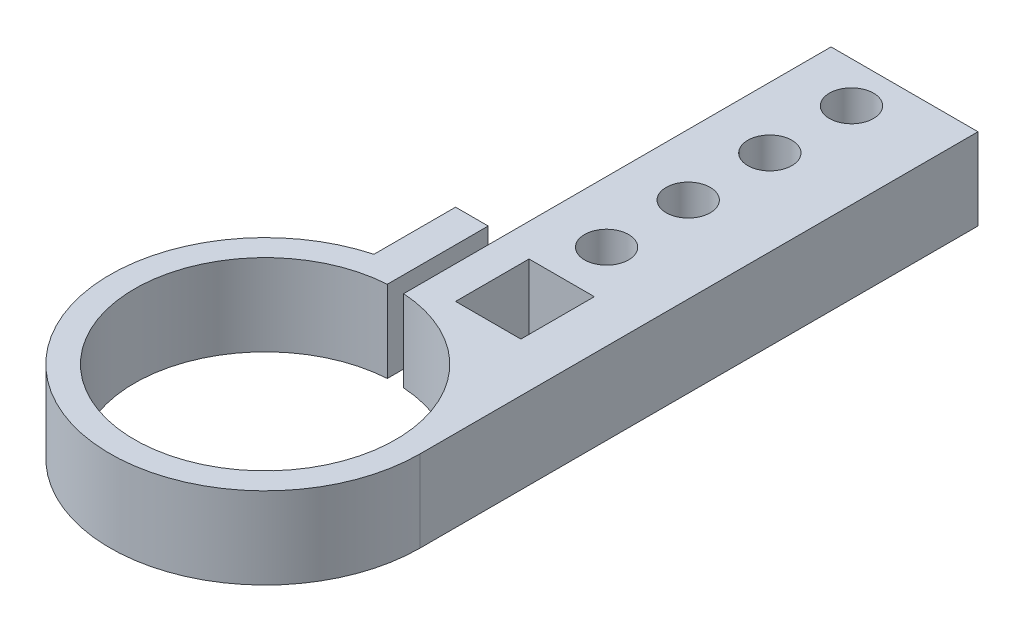
ISO-10303-21;
HEADER;
FILE_DESCRIPTION(('STEP AP214'),'2;1');
FILE_NAME('part.step','',(''),(''),'','','');
FILE_SCHEMA(('AUTOMOTIVE_DESIGN { 1 0 10303 214 1 1 1 1 }'));
ENDSEC;
DATA;
#1=APPLICATION_CONTEXT('core data for automotive mechanical design processes');
#2=APPLICATION_PROTOCOL_DEFINITION('international standard','automotive_design',2000,#1);
#3=PRODUCT_CONTEXT('',#1,'mechanical');
#4=PRODUCT('Part','Part','',(#3));
#5=PRODUCT_RELATED_PRODUCT_CATEGORY('part','',(#4));
#6=PRODUCT_DEFINITION_FORMATION('','',#4);
#7=PRODUCT_DEFINITION_CONTEXT('part definition',#1,'design');
#8=PRODUCT_DEFINITION('design','',#6,#7);
#9=PRODUCT_DEFINITION_SHAPE('','',#8);
#10=(LENGTH_UNIT() NAMED_UNIT(*) SI_UNIT(.MILLI.,.METRE.));
#11=(NAMED_UNIT(*) PLANE_ANGLE_UNIT() SI_UNIT($,.RADIAN.));
#12=(NAMED_UNIT(*) SI_UNIT($,.STERADIAN.) SOLID_ANGLE_UNIT());
#13=UNCERTAINTY_MEASURE_WITH_UNIT(LENGTH_MEASURE(1.E-05),#10,'distance_accuracy_value','');
#14=(GEOMETRIC_REPRESENTATION_CONTEXT(3) GLOBAL_UNCERTAINTY_ASSIGNED_CONTEXT((#13)) GLOBAL_UNIT_ASSIGNED_CONTEXT((#10,
#11,#12)) REPRESENTATION_CONTEXT('',''));
#15=CARTESIAN_POINT('',(0.,0.,0.));
#16=DIRECTION('',(0.,0.,1.));
#17=DIRECTION('',(1.,0.,0.));
#18=AXIS2_PLACEMENT_3D('',#15,#16,#17);
#19=CARTESIAN_POINT('',(0.,12.7,0.));
#20=DIRECTION('',(0.,-1.,0.));
#21=DIRECTION('',(0.,0.,-1.));
#22=AXIS2_PLACEMENT_3D('',#19,#20,#21);
#23=CYLINDRICAL_SURFACE('',#22,24.13);
#24=DIRECTION('',(0.,-1.,0.));
#25=VECTOR('',#24,1.);
#26=CARTESIAN_POINT('',(24.13,12.7,0.));
#27=LINE('',#26,#25);
#28=CARTESIAN_POINT('',(24.13,12.7,0.));
#29=VERTEX_POINT('',#28);
#30=CARTESIAN_POINT('',(24.13,0.,0.));
#31=VERTEX_POINT('',#30);
#32=EDGE_CURVE('E272',#29,#31,#27,.T.);
#33=ORIENTED_EDGE('',*,*,#32,.F.);
#34=CARTESIAN_POINT('',(0.,12.7,0.));
#35=DIRECTION('',(0.,1.,0.));
#36=DIRECTION('',(0.,0.,1.));
#37=AXIS2_PLACEMENT_3D('',#34,#35,#36);
#38=CIRCLE('',#37,24.13);
#39=CARTESIAN_POINT('',(-6.34999999999999,12.7,-23.2794845303757));
#40=VERTEX_POINT('',#39);
#41=EDGE_CURVE('E45',#40,#29,#38,.T.);
#42=ORIENTED_EDGE('',*,*,#41,.F.);
#43=DIRECTION('',(0.,-1.,0.));
#44=VECTOR('',#43,1.);
#45=CARTESIAN_POINT('',(-6.35,12.7,-23.2794845303757));
#46=LINE('',#45,#44);
#47=CARTESIAN_POINT('',(-6.35,0.,-23.2794845303757));
#48=VERTEX_POINT('',#47);
#49=EDGE_CURVE('E217',#40,#48,#46,.T.);
#50=ORIENTED_EDGE('',*,*,#49,.T.);
#51=CARTESIAN_POINT('',(0.,0.,0.));
#52=DIRECTION('',(0.,1.,0.));
#53=DIRECTION('',(0.,0.,1.));
#54=AXIS2_PLACEMENT_3D('',#51,#52,#53);
#55=CIRCLE('',#54,24.13);
#56=EDGE_CURVE('E200',#48,#31,#55,.T.);
#57=ORIENTED_EDGE('',*,*,#56,.T.);
#58=EDGE_LOOP('',(#33,#42,#50,#57));
#59=FACE_BOUND('',#58,.T.);
#60=ADVANCED_FACE('F38',(#59),#23,.T.);
#61=CARTESIAN_POINT('',(0.,12.7,0.));
#62=DIRECTION('',(0.,1.,0.));
#63=DIRECTION('',(0.,0.,1.));
#64=AXIS2_PLACEMENT_3D('',#61,#62,#63);
#65=PLANE('',#64);
#66=CARTESIAN_POINT('',(10.7950000000001,12.7,-67.7294845303757));
#67=DIRECTION('',(0.,1.,0.));
#68=DIRECTION('',(0.,0.,1.));
#69=AXIS2_PLACEMENT_3D('',#66,#67,#68);
#70=CIRCLE('',#69,3.42900000000001);
#71=CARTESIAN_POINT('',(10.7950000000001,12.7,-64.3004845303757));
#72=VERTEX_POINT('',#71);
#73=EDGE_CURVE('E171',#72,#72,#70,.T.);
#74=ORIENTED_EDGE('',*,*,#73,.F.);
#75=EDGE_LOOP('',(#74));
#76=FACE_BOUND('',#75,.T.);
#77=DIRECTION('',(1.,0.,0.));
#78=VECTOR('',#77,1.);
#79=CARTESIAN_POINT('',(6.35,12.7,-23.2794845303757));
#80=LINE('',#79,#78);
#81=CARTESIAN_POINT('',(6.35,12.7,-23.2794845303757));
#82=VERTEX_POINT('',#81);
#83=CARTESIAN_POINT('',(16.51,12.7,-23.2794845303757));
#84=VERTEX_POINT('',#83);
#85=EDGE_CURVE('E134',#82,#84,#80,.T.);
#86=ORIENTED_EDGE('',*,*,#85,.F.);
#87=DIRECTION('',(0.,0.,1.));
#88=VECTOR('',#87,1.);
#89=CARTESIAN_POINT('',(6.35,12.7,-34.7094845303757));
#90=LINE('',#89,#88);
#91=CARTESIAN_POINT('',(6.35,12.7,-34.7094845303757));
#92=VERTEX_POINT('',#91);
#93=EDGE_CURVE('E125',#92,#82,#90,.T.);
#94=ORIENTED_EDGE('',*,*,#93,.F.);
#95=DIRECTION('',(-1.,0.,0.));
#96=VECTOR('',#95,1.);
#97=CARTESIAN_POINT('',(6.35,12.7,-34.7094845303757));
#98=LINE('',#97,#96);
#99=CARTESIAN_POINT('',(16.51,12.7,-34.7094845303757));
#100=VERTEX_POINT('',#99);
#101=EDGE_CURVE('E153',#100,#92,#98,.T.);
#102=ORIENTED_EDGE('',*,*,#101,.F.);
#103=DIRECTION('',(0.,0.,-1.));
#104=VECTOR('',#103,1.);
#105=CARTESIAN_POINT('',(16.51,12.7,-34.7094845303757));
#106=LINE('',#105,#104);
#107=EDGE_CURVE('E148',#84,#100,#106,.T.);
#108=ORIENTED_EDGE('',*,*,#107,.F.);
#109=EDGE_LOOP('',(#86,#94,#102,#108));
#110=FACE_BOUND('',#109,.T.);
#111=CARTESIAN_POINT('',(10.7950000000003,12.7,-55.0294845303757));
#112=DIRECTION('',(0.,1.,0.));
#113=DIRECTION('',(0.,0.,1.));
#114=AXIS2_PLACEMENT_3D('',#111,#112,#113);
#115=CIRCLE('',#114,3.42900000000001);
#116=CARTESIAN_POINT('',(10.7950000000003,12.7,-51.6004845303757));
#117=VERTEX_POINT('',#116);
#118=EDGE_CURVE('E450',#117,#117,#115,.T.);
#119=ORIENTED_EDGE('',*,*,#118,.F.);
#120=EDGE_LOOP('',(#119));
#121=FACE_BOUND('',#120,.T.);
#122=CARTESIAN_POINT('',(10.7950000000004,12.7,-42.3294845303757));
#123=DIRECTION('',(0.,1.,0.));
#124=DIRECTION('',(0.,0.,1.));
#125=AXIS2_PLACEMENT_3D('',#122,#123,#124);
#126=CIRCLE('',#125,3.42900000000001);
#127=CARTESIAN_POINT('',(10.7950000000004,12.7,-38.9004845303757));
#128=VERTEX_POINT('',#127);
#129=EDGE_CURVE('E459',#128,#128,#126,.T.);
#130=ORIENTED_EDGE('',*,*,#129,.F.);
#131=EDGE_LOOP('',(#130));
#132=FACE_BOUND('',#131,.T.);
#133=CARTESIAN_POINT('',(10.795,12.7,-80.4294845303757));
#134=DIRECTION('',(0.,1.,0.));
#135=DIRECTION('',(0.,0.,1.));
#136=AXIS2_PLACEMENT_3D('',#133,#134,#135);
#137=CIRCLE('',#136,3.42900000000001);
#138=CARTESIAN_POINT('',(10.795,12.7,-77.0004845303757));
#139=VERTEX_POINT('',#138);
#140=EDGE_CURVE('E181',#139,#139,#137,.T.);
#141=ORIENTED_EDGE('',*,*,#140,.F.);
#142=EDGE_LOOP('',(#141));
#143=FACE_BOUND('',#142,.T.);
#144=ORIENTED_EDGE('',*,*,#41,.T.);
#145=DIRECTION('',(0.,0.,1.));
#146=VECTOR('',#145,1.);
#147=CARTESIAN_POINT('',(24.13,12.7,-35.9794845303757));
#148=LINE('',#147,#146);
#149=CARTESIAN_POINT('',(24.13,12.7,-86.7794845303757));
#150=VERTEX_POINT('',#149);
#151=EDGE_CURVE('E274',#150,#29,#148,.T.);
#152=ORIENTED_EDGE('',*,*,#151,.F.);
#153=DIRECTION('',(-1.,0.,0.));
#154=VECTOR('',#153,1.);
#155=CARTESIAN_POINT('',(24.13,12.7,-86.7794845303757));
#156=LINE('',#155,#154);
#157=CARTESIAN_POINT('',(1.27,12.7,-86.7794845303757));
#158=VERTEX_POINT('',#157);
#159=EDGE_CURVE('E186',#150,#158,#156,.T.);
#160=ORIENTED_EDGE('',*,*,#159,.T.);
#161=DIRECTION('',(0.,0.,-1.));
#162=VECTOR('',#161,1.);
#163=CARTESIAN_POINT('',(1.27,12.7,-1.43164468337886));
#164=LINE('',#163,#162);
#165=CARTESIAN_POINT('',(1.27,12.7,-20.2802736667926));
#166=VERTEX_POINT('',#165);
#167=EDGE_CURVE('E231',#166,#158,#164,.T.);
#168=ORIENTED_EDGE('',*,*,#167,.F.);
#169=CARTESIAN_POINT('',(0.,12.7,0.));
#170=DIRECTION('',(0.,1.,0.));
#171=DIRECTION('',(0.,0.,1.));
#172=AXIS2_PLACEMENT_3D('',#169,#170,#171);
#173=CIRCLE('',#172,20.32);
#174=CARTESIAN_POINT('',(-1.27,12.7,-20.2802736667926));
#175=VERTEX_POINT('',#174);
#176=EDGE_CURVE('E204',#175,#166,#173,.T.);
#177=ORIENTED_EDGE('',*,*,#176,.F.);
#178=DIRECTION('',(0.,0.,1.));
#179=VECTOR('',#178,1.);
#180=CARTESIAN_POINT('',(-1.27,12.7,-1.43164468337886));
#181=LINE('',#180,#179);
#182=CARTESIAN_POINT('',(-1.27,12.7,-35.9794845303757));
#183=VERTEX_POINT('',#182);
#184=EDGE_CURVE('E227',#183,#175,#181,.T.);
#185=ORIENTED_EDGE('',*,*,#184,.F.);
#186=DIRECTION('',(-1.,0.,0.));
#187=VECTOR('',#186,1.);
#188=CARTESIAN_POINT('',(6.35,12.7,-35.9794845303757));
#189=LINE('',#188,#187);
#190=CARTESIAN_POINT('',(-6.35,12.7,-35.9794845303757));
#191=VERTEX_POINT('',#190);
#192=EDGE_CURVE('E247',#183,#191,#189,.T.);
#193=ORIENTED_EDGE('',*,*,#192,.T.);
#194=DIRECTION('',(0.,0.,1.));
#195=VECTOR('',#194,1.);
#196=CARTESIAN_POINT('',(-6.35,12.7,-35.9794845303757));
#197=LINE('',#196,#195);
#198=EDGE_CURVE('E243',#191,#40,#197,.T.);
#199=ORIENTED_EDGE('',*,*,#198,.T.);
#200=EDGE_LOOP('',(#144,#152,#160,#168,#177,#185,#193,#199));
#201=FACE_BOUND('',#200,.T.);
#202=ADVANCED_FACE('F146',(#76,#110,#121,#132,#143,#201),#65,.T.);
#203=CARTESIAN_POINT('',(0.,0.,0.));
#204=DIRECTION('',(0.,1.,0.));
#205=DIRECTION('',(0.,0.,1.));
#206=AXIS2_PLACEMENT_3D('',#203,#204,#205);
#207=PLANE('',#206);
#208=CARTESIAN_POINT('',(10.7950000000001,0.,-67.7294845303757));
#209=DIRECTION('',(0.,1.,0.));
#210=DIRECTION('',(0.,0.,1.));
#211=AXIS2_PLACEMENT_3D('',#208,#209,#210);
#212=CIRCLE('',#211,3.42900000000001);
#213=CARTESIAN_POINT('',(10.7950000000001,0.,-64.3004845303757));
#214=VERTEX_POINT('',#213);
#215=EDGE_CURVE('E449',#214,#214,#212,.T.);
#216=ORIENTED_EDGE('',*,*,#215,.T.);
#217=EDGE_LOOP('',(#216));
#218=FACE_BOUND('',#217,.T.);
#219=DIRECTION('',(0.,0.,1.));
#220=VECTOR('',#219,1.);
#221=CARTESIAN_POINT('',(6.35,0.,-34.7094845303757));
#222=LINE('',#221,#220);
#223=CARTESIAN_POINT('',(6.35,0.,-34.7094845303757));
#224=VERTEX_POINT('',#223);
#225=CARTESIAN_POINT('',(6.35,0.,-23.2794845303757));
#226=VERTEX_POINT('',#225);
#227=EDGE_CURVE('E60',#224,#226,#222,.T.);
#228=ORIENTED_EDGE('',*,*,#227,.T.);
#229=DIRECTION('',(1.,0.,0.));
#230=VECTOR('',#229,1.);
#231=CARTESIAN_POINT('',(6.35,0.,-23.2794845303757));
#232=LINE('',#231,#230);
#233=CARTESIAN_POINT('',(16.51,0.,-23.2794845303757));
#234=VERTEX_POINT('',#233);
#235=EDGE_CURVE('E141',#226,#234,#232,.T.);
#236=ORIENTED_EDGE('',*,*,#235,.T.);
#237=DIRECTION('',(0.,0.,-1.));
#238=VECTOR('',#237,1.);
#239=CARTESIAN_POINT('',(16.51,0.,-34.7094845303757));
#240=LINE('',#239,#238);
#241=CARTESIAN_POINT('',(16.51,0.,-34.7094845303757));
#242=VERTEX_POINT('',#241);
#243=EDGE_CURVE('E173',#234,#242,#240,.T.);
#244=ORIENTED_EDGE('',*,*,#243,.T.);
#245=DIRECTION('',(-1.,0.,0.));
#246=VECTOR('',#245,1.);
#247=CARTESIAN_POINT('',(6.35,0.,-34.7094845303757));
#248=LINE('',#247,#246);
#249=EDGE_CURVE('E135',#242,#224,#248,.T.);
#250=ORIENTED_EDGE('',*,*,#249,.T.);
#251=EDGE_LOOP('',(#228,#236,#244,#250));
#252=FACE_BOUND('',#251,.T.);
#253=CARTESIAN_POINT('',(10.7950000000003,0.,-55.0294845303757));
#254=DIRECTION('',(0.,1.,0.));
#255=DIRECTION('',(0.,0.,1.));
#256=AXIS2_PLACEMENT_3D('',#253,#254,#255);
#257=CIRCLE('',#256,3.42900000000001);
#258=CARTESIAN_POINT('',(10.7950000000003,0.,-51.6004845303757));
#259=VERTEX_POINT('',#258);
#260=EDGE_CURVE('E453',#259,#259,#257,.T.);
#261=ORIENTED_EDGE('',*,*,#260,.T.);
#262=EDGE_LOOP('',(#261));
#263=FACE_BOUND('',#262,.T.);
#264=CARTESIAN_POINT('',(10.7950000000004,0.,-42.3294845303757));
#265=DIRECTION('',(0.,1.,0.));
#266=DIRECTION('',(0.,0.,1.));
#267=AXIS2_PLACEMENT_3D('',#264,#265,#266);
#268=CIRCLE('',#267,3.42900000000001);
#269=CARTESIAN_POINT('',(10.7950000000004,0.,-38.9004845303757));
#270=VERTEX_POINT('',#269);
#271=EDGE_CURVE('E457',#270,#270,#268,.T.);
#272=ORIENTED_EDGE('',*,*,#271,.T.);
#273=EDGE_LOOP('',(#272));
#274=FACE_BOUND('',#273,.T.);
#275=CARTESIAN_POINT('',(10.795,0.,-80.4294845303757));
#276=DIRECTION('',(0.,1.,0.));
#277=DIRECTION('',(0.,0.,1.));
#278=AXIS2_PLACEMENT_3D('',#275,#276,#277);
#279=CIRCLE('',#278,3.42900000000001);
#280=CARTESIAN_POINT('',(10.795,0.,-77.0004845303757));
#281=VERTEX_POINT('',#280);
#282=EDGE_CURVE('E142',#281,#281,#279,.T.);
#283=ORIENTED_EDGE('',*,*,#282,.T.);
#284=EDGE_LOOP('',(#283));
#285=FACE_BOUND('',#284,.T.);
#286=DIRECTION('',(0.,0.,-1.));
#287=VECTOR('',#286,1.);
#288=CARTESIAN_POINT('',(1.27,0.,-1.43164468337886));
#289=LINE('',#288,#287);
#290=CARTESIAN_POINT('',(1.27,0.,-20.2802736667926));
#291=VERTEX_POINT('',#290);
#292=CARTESIAN_POINT('',(1.27,0.,-86.7794845303757));
#293=VERTEX_POINT('',#292);
#294=EDGE_CURVE('E234',#291,#293,#289,.T.);
#295=ORIENTED_EDGE('',*,*,#294,.T.);
#296=DIRECTION('',(-1.,0.,0.));
#297=VECTOR('',#296,1.);
#298=CARTESIAN_POINT('',(24.13,0.,-86.7794845303757));
#299=LINE('',#298,#297);
#300=CARTESIAN_POINT('',(24.13,0.,-86.7794845303757));
#301=VERTEX_POINT('',#300);
#302=EDGE_CURVE('E268',#301,#293,#299,.T.);
#303=ORIENTED_EDGE('',*,*,#302,.F.);
#304=DIRECTION('',(0.,0.,-1.));
#305=VECTOR('',#304,1.);
#306=CARTESIAN_POINT('',(24.13,0.,-35.9794845303757));
#307=LINE('',#306,#305);
#308=EDGE_CURVE('E237',#31,#301,#307,.T.);
#309=ORIENTED_EDGE('',*,*,#308,.F.);
#310=ORIENTED_EDGE('',*,*,#56,.F.);
#311=DIRECTION('',(0.,0.,1.));
#312=VECTOR('',#311,1.);
#313=CARTESIAN_POINT('',(-6.35,0.,-35.9794845303757));
#314=LINE('',#313,#312);
#315=CARTESIAN_POINT('',(-6.35,0.,-35.9794845303757));
#316=VERTEX_POINT('',#315);
#317=EDGE_CURVE('E242',#316,#48,#314,.T.);
#318=ORIENTED_EDGE('',*,*,#317,.F.);
#319=DIRECTION('',(-1.,0.,0.));
#320=VECTOR('',#319,1.);
#321=CARTESIAN_POINT('',(6.35,0.,-35.9794845303757));
#322=LINE('',#321,#320);
#323=CARTESIAN_POINT('',(-1.27,0.,-35.9794845303757));
#324=VERTEX_POINT('',#323);
#325=EDGE_CURVE('E248',#324,#316,#322,.T.);
#326=ORIENTED_EDGE('',*,*,#325,.F.);
#327=DIRECTION('',(0.,0.,1.));
#328=VECTOR('',#327,1.);
#329=CARTESIAN_POINT('',(-1.27,0.,-1.43164468337886));
#330=LINE('',#329,#328);
#331=CARTESIAN_POINT('',(-1.27,0.,-20.2802736667926));
#332=VERTEX_POINT('',#331);
#333=EDGE_CURVE('E236',#324,#332,#330,.T.);
#334=ORIENTED_EDGE('',*,*,#333,.T.);
#335=CARTESIAN_POINT('',(0.,0.,0.));
#336=DIRECTION('',(0.,1.,0.));
#337=DIRECTION('',(0.,0.,1.));
#338=AXIS2_PLACEMENT_3D('',#335,#336,#337);
#339=CIRCLE('',#338,20.32);
#340=EDGE_CURVE('E201',#332,#291,#339,.T.);
#341=ORIENTED_EDGE('',*,*,#340,.T.);
#342=EDGE_LOOP('',(#295,#303,#309,#310,#318,#326,#334,#341));
#343=FACE_BOUND('',#342,.T.);
#344=ADVANCED_FACE('F264',(#218,#252,#263,#274,#285,#343),#207,.F.);
#345=CARTESIAN_POINT('',(0.,12.7,0.));
#346=DIRECTION('',(0.,-1.,0.));
#347=DIRECTION('',(0.,0.,-1.));
#348=AXIS2_PLACEMENT_3D('',#345,#346,#347);
#349=CYLINDRICAL_SURFACE('',#348,20.32);
#350=ORIENTED_EDGE('',*,*,#176,.T.);
#351=DIRECTION('',(0.,-1.,0.));
#352=VECTOR('',#351,1.);
#353=CARTESIAN_POINT('',(1.27,12.7,-20.2802736667926));
#354=LINE('',#353,#352);
#355=EDGE_CURVE('E241',#166,#291,#354,.T.);
#356=ORIENTED_EDGE('',*,*,#355,.T.);
#357=ORIENTED_EDGE('',*,*,#340,.F.);
#358=DIRECTION('',(0.,-1.,0.));
#359=VECTOR('',#358,1.);
#360=CARTESIAN_POINT('',(-1.27,12.7,-20.2802736667926));
#361=LINE('',#360,#359);
#362=EDGE_CURVE('E230',#332,#175,#361,.F.);
#363=ORIENTED_EDGE('',*,*,#362,.T.);
#364=EDGE_LOOP('',(#350,#356,#357,#363));
#365=FACE_BOUND('',#364,.T.);
#366=ADVANCED_FACE('F313',(#365),#349,.F.);
#367=CARTESIAN_POINT('',(6.35,12.7,-35.9794845303757));
#368=DIRECTION('',(0.,0.,1.));
#369=DIRECTION('',(1.,0.,0.));
#370=AXIS2_PLACEMENT_3D('',#367,#368,#369);
#371=PLANE('',#370);
#372=DIRECTION('',(0.,1.,0.));
#373=VECTOR('',#372,1.);
#374=CARTESIAN_POINT('',(-1.27,12.7,-35.9794845303757));
#375=LINE('',#374,#373);
#376=EDGE_CURVE('E12',#324,#183,#375,.T.);
#377=ORIENTED_EDGE('',*,*,#376,.F.);
#378=ORIENTED_EDGE('',*,*,#325,.T.);
#379=DIRECTION('',(0.,-1.,0.));
#380=VECTOR('',#379,1.);
#381=CARTESIAN_POINT('',(-6.35,12.7,-35.9794845303757));
#382=LINE('',#381,#380);
#383=EDGE_CURVE('E252',#191,#316,#382,.T.);
#384=ORIENTED_EDGE('',*,*,#383,.F.);
#385=ORIENTED_EDGE('',*,*,#192,.F.);
#386=EDGE_LOOP('',(#377,#378,#384,#385));
#387=FACE_BOUND('',#386,.T.);
#388=ADVANCED_FACE('F319',(#387),#371,.F.);
#389=CARTESIAN_POINT('',(-6.35,12.7,-35.9794845303757));
#390=DIRECTION('',(1.,0.,0.));
#391=DIRECTION('',(0.,0.,-1.));
#392=AXIS2_PLACEMENT_3D('',#389,#390,#391);
#393=PLANE('',#392);
#394=ORIENTED_EDGE('',*,*,#317,.T.);
#395=ORIENTED_EDGE('',*,*,#49,.F.);
#396=ORIENTED_EDGE('',*,*,#198,.F.);
#397=ORIENTED_EDGE('',*,*,#383,.T.);
#398=EDGE_LOOP('',(#394,#395,#396,#397));
#399=FACE_BOUND('',#398,.T.);
#400=ADVANCED_FACE('F261',(#399),#393,.F.);
#401=CARTESIAN_POINT('',(-1.27,12.7,-1.43164468337886));
#402=DIRECTION('',(1.,0.,0.));
#403=DIRECTION('',(0.,0.,-1.));
#404=AXIS2_PLACEMENT_3D('',#401,#402,#403);
#405=PLANE('',#404);
#406=ORIENTED_EDGE('',*,*,#333,.F.);
#407=ORIENTED_EDGE('',*,*,#376,.T.);
#408=ORIENTED_EDGE('',*,*,#184,.T.);
#409=ORIENTED_EDGE('',*,*,#362,.F.);
#410=EDGE_LOOP('',(#406,#407,#408,#409));
#411=FACE_BOUND('',#410,.T.);
#412=ADVANCED_FACE('F300',(#411),#405,.T.);
#413=CARTESIAN_POINT('',(1.27,12.7,-1.43164468337886));
#414=DIRECTION('',(-1.,0.,0.));
#415=DIRECTION('',(0.,0.,1.));
#416=AXIS2_PLACEMENT_3D('',#413,#414,#415);
#417=PLANE('',#416);
#418=ORIENTED_EDGE('',*,*,#167,.T.);
#419=DIRECTION('',(0.,1.,0.));
#420=VECTOR('',#419,1.);
#421=CARTESIAN_POINT('',(1.27,0.,-86.7794845303757));
#422=LINE('',#421,#420);
#423=EDGE_CURVE('E280',#293,#158,#422,.T.);
#424=ORIENTED_EDGE('',*,*,#423,.F.);
#425=ORIENTED_EDGE('',*,*,#294,.F.);
#426=ORIENTED_EDGE('',*,*,#355,.F.);
#427=EDGE_LOOP('',(#418,#424,#425,#426));
#428=FACE_BOUND('',#427,.T.);
#429=ADVANCED_FACE('F292',(#428),#417,.T.);
#430=CARTESIAN_POINT('',(24.13,0.,0.));
#431=DIRECTION('',(-1.,0.,0.));
#432=DIRECTION('',(0.,0.,1.));
#433=AXIS2_PLACEMENT_3D('',#430,#431,#432);
#434=PLANE('',#433);
#435=ORIENTED_EDGE('',*,*,#308,.T.);
#436=DIRECTION('',(0.,1.,0.));
#437=VECTOR('',#436,1.);
#438=CARTESIAN_POINT('',(24.13,0.,-86.7794845303757));
#439=LINE('',#438,#437);
#440=EDGE_CURVE('E276',#301,#150,#439,.T.);
#441=ORIENTED_EDGE('',*,*,#440,.T.);
#442=ORIENTED_EDGE('',*,*,#151,.T.);
#443=ORIENTED_EDGE('',*,*,#32,.T.);
#444=EDGE_LOOP('',(#435,#441,#442,#443));
#445=FACE_BOUND('',#444,.T.);
#446=ADVANCED_FACE('F290',(#445),#434,.F.);
#447=CARTESIAN_POINT('',(24.13,0.,-86.7794845303757));
#448=DIRECTION('',(0.,0.,-1.));
#449=DIRECTION('',(-1.,0.,0.));
#450=AXIS2_PLACEMENT_3D('',#447,#448,#449);
#451=PLANE('',#450);
#452=ORIENTED_EDGE('',*,*,#159,.F.);
#453=ORIENTED_EDGE('',*,*,#440,.F.);
#454=ORIENTED_EDGE('',*,*,#302,.T.);
#455=ORIENTED_EDGE('',*,*,#423,.T.);
#456=EDGE_LOOP('',(#452,#453,#454,#455));
#457=FACE_BOUND('',#456,.T.);
#458=ADVANCED_FACE('F289',(#457),#451,.T.);
#459=CARTESIAN_POINT('',(10.795,12.7,-80.4294845303757));
#460=DIRECTION('',(0.,-1.,0.));
#461=DIRECTION('',(0.,0.,-1.));
#462=AXIS2_PLACEMENT_3D('',#459,#460,#461);
#463=CYLINDRICAL_SURFACE('',#462,3.42900000000001);
#464=ORIENTED_EDGE('',*,*,#140,.T.);
#465=EDGE_LOOP('',(#464));
#466=FACE_BOUND('',#465,.T.);
#467=ORIENTED_EDGE('',*,*,#282,.F.);
#468=EDGE_LOOP('',(#467));
#469=FACE_BOUND('',#468,.T.);
#470=ADVANCED_FACE('F298',(#466,#469),#463,.F.);
#471=CARTESIAN_POINT('',(10.7950000000004,12.7,-42.3294845303757));
#472=DIRECTION('',(0.,-1.,0.));
#473=DIRECTION('',(0.,0.,-1.));
#474=AXIS2_PLACEMENT_3D('',#471,#472,#473);
#475=CYLINDRICAL_SURFACE('',#474,3.42900000000001);
#476=ORIENTED_EDGE('',*,*,#129,.T.);
#477=EDGE_LOOP('',(#476));
#478=FACE_BOUND('',#477,.T.);
#479=ORIENTED_EDGE('',*,*,#271,.F.);
#480=EDGE_LOOP('',(#479));
#481=FACE_BOUND('',#480,.T.);
#482=ADVANCED_FACE('F376',(#478,#481),#475,.F.);
#483=CARTESIAN_POINT('',(10.7950000000003,12.7,-55.0294845303757));
#484=DIRECTION('',(0.,-1.,0.));
#485=DIRECTION('',(0.,0.,-1.));
#486=AXIS2_PLACEMENT_3D('',#483,#484,#485);
#487=CYLINDRICAL_SURFACE('',#486,3.42900000000001);
#488=ORIENTED_EDGE('',*,*,#118,.T.);
#489=EDGE_LOOP('',(#488));
#490=FACE_BOUND('',#489,.T.);
#491=ORIENTED_EDGE('',*,*,#260,.F.);
#492=EDGE_LOOP('',(#491));
#493=FACE_BOUND('',#492,.T.);
#494=ADVANCED_FACE('F386',(#490,#493),#487,.F.);
#495=CARTESIAN_POINT('',(6.35,12.7,-34.7094845303757));
#496=DIRECTION('',(1.,0.,0.));
#497=DIRECTION('',(0.,0.,-1.));
#498=AXIS2_PLACEMENT_3D('',#495,#496,#497);
#499=PLANE('',#498);
#500=ORIENTED_EDGE('',*,*,#227,.F.);
#501=DIRECTION('',(0.,-1.,0.));
#502=VECTOR('',#501,1.);
#503=CARTESIAN_POINT('',(6.35,12.7,-34.7094845303757));
#504=LINE('',#503,#502);
#505=EDGE_CURVE('E129',#92,#224,#504,.T.);
#506=ORIENTED_EDGE('',*,*,#505,.F.);
#507=ORIENTED_EDGE('',*,*,#93,.T.);
#508=DIRECTION('',(0.,-1.,0.));
#509=VECTOR('',#508,1.);
#510=CARTESIAN_POINT('',(6.35,12.7,-23.2794845303757));
#511=LINE('',#510,#509);
#512=EDGE_CURVE('E128',#82,#226,#511,.T.);
#513=ORIENTED_EDGE('',*,*,#512,.T.);
#514=EDGE_LOOP('',(#500,#506,#507,#513));
#515=FACE_BOUND('',#514,.T.);
#516=ADVANCED_FACE('F127',(#515),#499,.T.);
#517=CARTESIAN_POINT('',(6.35,12.7,-23.2794845303757));
#518=DIRECTION('',(0.,0.,-1.));
#519=DIRECTION('',(-1.,0.,0.));
#520=AXIS2_PLACEMENT_3D('',#517,#518,#519);
#521=PLANE('',#520);
#522=ORIENTED_EDGE('',*,*,#235,.F.);
#523=ORIENTED_EDGE('',*,*,#512,.F.);
#524=ORIENTED_EDGE('',*,*,#85,.T.);
#525=DIRECTION('',(0.,-1.,0.));
#526=VECTOR('',#525,1.);
#527=CARTESIAN_POINT('',(16.51,12.7,-23.2794845303757));
#528=LINE('',#527,#526);
#529=EDGE_CURVE('E143',#84,#234,#528,.T.);
#530=ORIENTED_EDGE('',*,*,#529,.T.);
#531=EDGE_LOOP('',(#522,#523,#524,#530));
#532=FACE_BOUND('',#531,.T.);
#533=ADVANCED_FACE('F138',(#532),#521,.T.);
#534=CARTESIAN_POINT('',(16.51,12.7,-34.7094845303757));
#535=DIRECTION('',(-1.,0.,0.));
#536=DIRECTION('',(0.,0.,1.));
#537=AXIS2_PLACEMENT_3D('',#534,#535,#536);
#538=PLANE('',#537);
#539=ORIENTED_EDGE('',*,*,#243,.F.);
#540=ORIENTED_EDGE('',*,*,#529,.F.);
#541=ORIENTED_EDGE('',*,*,#107,.T.);
#542=DIRECTION('',(0.,-1.,0.));
#543=VECTOR('',#542,1.);
#544=CARTESIAN_POINT('',(16.51,12.7,-34.7094845303757));
#545=LINE('',#544,#543);
#546=EDGE_CURVE('E52',#100,#242,#545,.T.);
#547=ORIENTED_EDGE('',*,*,#546,.T.);
#548=EDGE_LOOP('',(#539,#540,#541,#547));
#549=FACE_BOUND('',#548,.T.);
#550=ADVANCED_FACE('F413',(#549),#538,.T.);
#551=CARTESIAN_POINT('',(6.35,12.7,-34.7094845303757));
#552=DIRECTION('',(0.,0.,1.));
#553=DIRECTION('',(1.,0.,0.));
#554=AXIS2_PLACEMENT_3D('',#551,#552,#553);
#555=PLANE('',#554);
#556=ORIENTED_EDGE('',*,*,#249,.F.);
#557=ORIENTED_EDGE('',*,*,#546,.F.);
#558=ORIENTED_EDGE('',*,*,#101,.T.);
#559=ORIENTED_EDGE('',*,*,#505,.T.);
#560=EDGE_LOOP('',(#556,#557,#558,#559));
#561=FACE_BOUND('',#560,.T.);
#562=ADVANCED_FACE('F422',(#561),#555,.T.);
#563=CARTESIAN_POINT('',(10.7950000000001,12.7,-67.7294845303757));
#564=DIRECTION('',(0.,-1.,0.));
#565=DIRECTION('',(0.,0.,-1.));
#566=AXIS2_PLACEMENT_3D('',#563,#564,#565);
#567=CYLINDRICAL_SURFACE('',#566,3.42900000000001);
#568=ORIENTED_EDGE('',*,*,#73,.T.);
#569=EDGE_LOOP('',(#568));
#570=FACE_BOUND('',#569,.T.);
#571=ORIENTED_EDGE('',*,*,#215,.F.);
#572=EDGE_LOOP('',(#571));
#573=FACE_BOUND('',#572,.T.);
#574=ADVANCED_FACE('F432',(#570,#573),#567,.F.);
#575=CLOSED_SHELL('',(#60,#202,#344,#366,#388,#400,#412,#429,#446,#458,#470,#482,#494,#516,#533,
#550,#562,#574));
#576=MANIFOLD_SOLID_BREP('B2',#575);
#577=ADVANCED_BREP_SHAPE_REPRESENTATION('',(#18,#576),#14);
#578=SHAPE_DEFINITION_REPRESENTATION(#9,#577);
ENDSEC;
END-ISO-10303-21;
